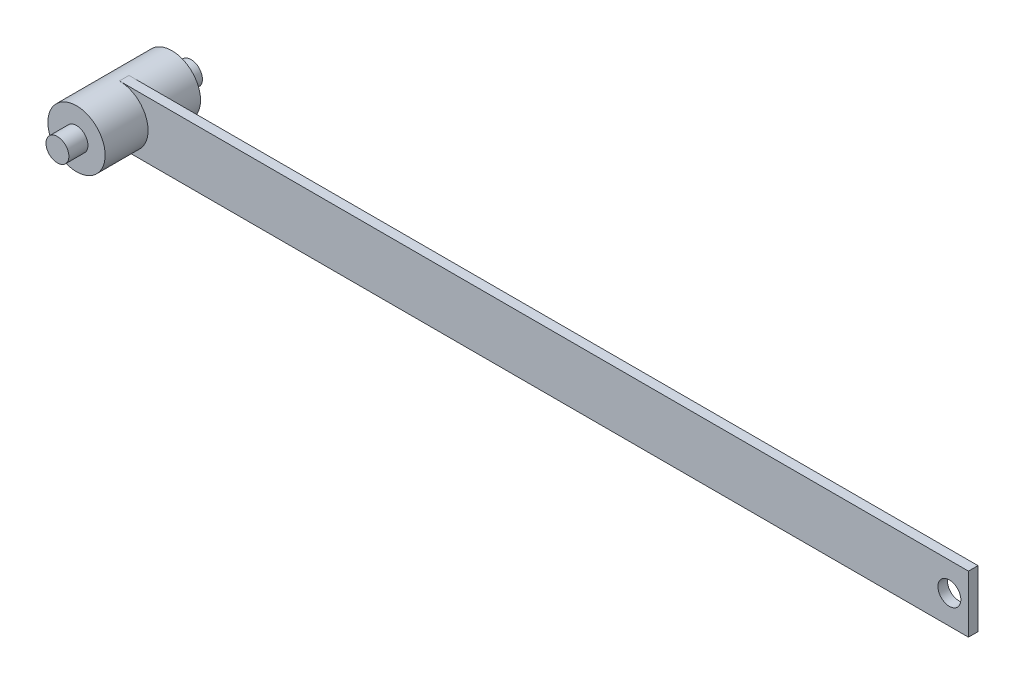
ISO-10303-21;
HEADER;
FILE_DESCRIPTION(('STEP AP214'),'2;1');
FILE_NAME('part.step','',(''),(''),'','','');
FILE_SCHEMA(('AUTOMOTIVE_DESIGN { 1 0 10303 214 1 1 1 1 }'));
ENDSEC;
DATA;
#1=APPLICATION_CONTEXT('core data for automotive mechanical design processes');
#2=APPLICATION_PROTOCOL_DEFINITION('international standard','automotive_design',2000,#1);
#3=PRODUCT_CONTEXT('',#1,'mechanical');
#4=PRODUCT('Part','Part','',(#3));
#5=PRODUCT_RELATED_PRODUCT_CATEGORY('part','',(#4));
#6=PRODUCT_DEFINITION_FORMATION('','',#4);
#7=PRODUCT_DEFINITION_CONTEXT('part definition',#1,'design');
#8=PRODUCT_DEFINITION('design','',#6,#7);
#9=PRODUCT_DEFINITION_SHAPE('','',#8);
#10=(LENGTH_UNIT() NAMED_UNIT(*) SI_UNIT(.MILLI.,.METRE.));
#11=(NAMED_UNIT(*) PLANE_ANGLE_UNIT() SI_UNIT($,.RADIAN.));
#12=(NAMED_UNIT(*) SI_UNIT($,.STERADIAN.) SOLID_ANGLE_UNIT());
#13=UNCERTAINTY_MEASURE_WITH_UNIT(LENGTH_MEASURE(1.E-05),#10,'distance_accuracy_value','');
#14=(GEOMETRIC_REPRESENTATION_CONTEXT(3) GLOBAL_UNCERTAINTY_ASSIGNED_CONTEXT((#13)) GLOBAL_UNIT_ASSIGNED_CONTEXT((#10,
#11,#12)) REPRESENTATION_CONTEXT('',''));
#15=CARTESIAN_POINT('',(0.,0.,0.));
#16=DIRECTION('',(0.,0.,1.));
#17=DIRECTION('',(1.,0.,0.));
#18=AXIS2_PLACEMENT_3D('',#15,#16,#17);
#19=CARTESIAN_POINT('',(-215.,0.,-2.5));
#20=DIRECTION('',(0.,0.,-1.));
#21=DIRECTION('',(-1.,0.,0.));
#22=AXIS2_PLACEMENT_3D('',#19,#20,#21);
#23=CYLINDRICAL_SURFACE('',#22,15.);
#24=DIRECTION('',(0.,0.,-1.));
#25=VECTOR('',#24,1.);
#26=CARTESIAN_POINT('',(-215.,15.,2.5));
#27=LINE('',#26,#25);
#28=CARTESIAN_POINT('',(-215.,15.,-2.5));
#29=VERTEX_POINT('',#28);
#30=CARTESIAN_POINT('',(-215.,15.,2.5));
#31=VERTEX_POINT('',#30);
#32=EDGE_CURVE('E94',#29,#31,#27,.F.);
#33=ORIENTED_EDGE('',*,*,#32,.F.);
#34=CARTESIAN_POINT('',(-215.,0.,-2.5));
#35=DIRECTION('',(0.,0.,1.));
#36=DIRECTION('',(1.,0.,0.));
#37=AXIS2_PLACEMENT_3D('',#34,#35,#36);
#38=CIRCLE('',#37,15.);
#39=CARTESIAN_POINT('',(-215.,-15.,-2.5));
#40=VERTEX_POINT('',#39);
#41=EDGE_CURVE('E62',#29,#40,#38,.F.);
#42=ORIENTED_EDGE('',*,*,#41,.T.);
#43=DIRECTION('',(0.,0.,-1.));
#44=VECTOR('',#43,1.);
#45=CARTESIAN_POINT('',(-215.,-15.,2.5));
#46=LINE('',#45,#44);
#47=CARTESIAN_POINT('',(-215.,-15.,2.5));
#48=VERTEX_POINT('',#47);
#49=EDGE_CURVE('E46',#48,#40,#46,.T.);
#50=ORIENTED_EDGE('',*,*,#49,.F.);
#51=CARTESIAN_POINT('',(-215.,0.,2.5));
#52=DIRECTION('',(0.,0.,1.));
#53=DIRECTION('',(1.,0.,0.));
#54=AXIS2_PLACEMENT_3D('',#51,#52,#53);
#55=CIRCLE('',#54,15.);
#56=EDGE_CURVE('E54',#31,#48,#55,.F.);
#57=ORIENTED_EDGE('',*,*,#56,.F.);
#58=EDGE_LOOP('',(#33,#42,#50,#57));
#59=FACE_BOUND('',#58,.T.);
#60=CARTESIAN_POINT('',(-215.,0.,-25.));
#61=DIRECTION('',(0.,0.,1.));
#62=DIRECTION('',(1.,0.,0.));
#63=AXIS2_PLACEMENT_3D('',#60,#61,#62);
#64=CIRCLE('',#63,15.);
#65=CARTESIAN_POINT('',(-200.,0.,-25.));
#66=VERTEX_POINT('',#65);
#67=EDGE_CURVE('E103',#66,#66,#64,.T.);
#68=ORIENTED_EDGE('',*,*,#67,.T.);
#69=EDGE_LOOP('',(#68));
#70=FACE_BOUND('',#69,.T.);
#71=CARTESIAN_POINT('',(-215.,0.,25.));
#72=DIRECTION('',(0.,0.,1.));
#73=DIRECTION('',(1.,0.,0.));
#74=AXIS2_PLACEMENT_3D('',#71,#72,#73);
#75=CIRCLE('',#74,15.);
#76=CARTESIAN_POINT('',(-200.,0.,25.));
#77=VERTEX_POINT('',#76);
#78=EDGE_CURVE('E98',#77,#77,#75,.T.);
#79=ORIENTED_EDGE('',*,*,#78,.F.);
#80=EDGE_LOOP('',(#79));
#81=FACE_BOUND('',#80,.T.);
#82=ADVANCED_FACE('F37',(#59,#70,#81),#23,.T.);
#83=CARTESIAN_POINT('',(0.,0.,2.5));
#84=DIRECTION('',(0.,0.,1.));
#85=DIRECTION('',(1.,0.,0.));
#86=AXIS2_PLACEMENT_3D('',#83,#84,#85);
#87=PLANE('',#86);
#88=DIRECTION('',(-1.,0.,0.));
#89=VECTOR('',#88,1.);
#90=CARTESIAN_POINT('',(-230.,15.,2.5));
#91=LINE('',#90,#89);
#92=CARTESIAN_POINT('',(230.,15.,2.5));
#93=VERTEX_POINT('',#92);
#94=EDGE_CURVE('E114',#93,#31,#91,.T.);
#95=ORIENTED_EDGE('',*,*,#94,.T.);
#96=ORIENTED_EDGE('',*,*,#56,.T.);
#97=DIRECTION('',(1.,0.,0.));
#98=VECTOR('',#97,1.);
#99=CARTESIAN_POINT('',(-230.,-15.,2.5));
#100=LINE('',#99,#98);
#101=CARTESIAN_POINT('',(230.,-15.,2.5));
#102=VERTEX_POINT('',#101);
#103=EDGE_CURVE('E92',#48,#102,#100,.T.);
#104=ORIENTED_EDGE('',*,*,#103,.T.);
#105=DIRECTION('',(0.,1.,0.));
#106=VECTOR('',#105,1.);
#107=CARTESIAN_POINT('',(230.,15.,2.5));
#108=LINE('',#107,#106);
#109=EDGE_CURVE('E87',#102,#93,#108,.T.);
#110=ORIENTED_EDGE('',*,*,#109,.T.);
#111=EDGE_LOOP('',(#95,#96,#104,#110));
#112=FACE_BOUND('',#111,.T.);
#113=CARTESIAN_POINT('',(220.,0.,2.5));
#114=DIRECTION('',(0.,0.,1.));
#115=DIRECTION('',(1.,0.,0.));
#116=AXIS2_PLACEMENT_3D('',#113,#114,#115);
#117=CIRCLE('',#116,6.00000000000002);
#118=CARTESIAN_POINT('',(226.,0.,2.5));
#119=VERTEX_POINT('',#118);
#120=EDGE_CURVE('E107',#119,#119,#117,.T.);
#121=ORIENTED_EDGE('',*,*,#120,.F.);
#122=EDGE_LOOP('',(#121));
#123=FACE_BOUND('',#122,.T.);
#124=ADVANCED_FACE('F126',(#112,#123),#87,.T.);
#125=CARTESIAN_POINT('',(0.,0.,-2.5));
#126=DIRECTION('',(0.,0.,1.));
#127=DIRECTION('',(1.,0.,0.));
#128=AXIS2_PLACEMENT_3D('',#125,#126,#127);
#129=PLANE('',#128);
#130=ORIENTED_EDGE('',*,*,#41,.F.);
#131=DIRECTION('',(-1.,0.,0.));
#132=VECTOR('',#131,1.);
#133=CARTESIAN_POINT('',(-230.,15.,-2.5));
#134=LINE('',#133,#132);
#135=CARTESIAN_POINT('',(230.,15.,-2.5));
#136=VERTEX_POINT('',#135);
#137=EDGE_CURVE('E88',#136,#29,#134,.T.);
#138=ORIENTED_EDGE('',*,*,#137,.F.);
#139=DIRECTION('',(0.,1.,0.));
#140=VECTOR('',#139,1.);
#141=CARTESIAN_POINT('',(230.,15.,-2.5));
#142=LINE('',#141,#140);
#143=CARTESIAN_POINT('',(230.,-15.,-2.5));
#144=VERTEX_POINT('',#143);
#145=EDGE_CURVE('E83',#144,#136,#142,.T.);
#146=ORIENTED_EDGE('',*,*,#145,.F.);
#147=DIRECTION('',(1.,0.,0.));
#148=VECTOR('',#147,1.);
#149=CARTESIAN_POINT('',(-230.,-15.,-2.5));
#150=LINE('',#149,#148);
#151=EDGE_CURVE('E78',#40,#144,#150,.T.);
#152=ORIENTED_EDGE('',*,*,#151,.F.);
#153=EDGE_LOOP('',(#130,#138,#146,#152));
#154=FACE_BOUND('',#153,.T.);
#155=CARTESIAN_POINT('',(220.,0.,-2.5));
#156=DIRECTION('',(0.,0.,1.));
#157=DIRECTION('',(1.,0.,0.));
#158=AXIS2_PLACEMENT_3D('',#155,#156,#157);
#159=CIRCLE('',#158,6.00000000000002);
#160=CARTESIAN_POINT('',(226.,0.,-2.5));
#161=VERTEX_POINT('',#160);
#162=EDGE_CURVE('E100',#161,#161,#159,.T.);
#163=ORIENTED_EDGE('',*,*,#162,.T.);
#164=EDGE_LOOP('',(#163));
#165=FACE_BOUND('',#164,.T.);
#166=ADVANCED_FACE('F80',(#154,#165),#129,.F.);
#167=CARTESIAN_POINT('',(230.,15.,2.5));
#168=DIRECTION('',(-1.,0.,0.));
#169=DIRECTION('',(0.,0.,1.));
#170=AXIS2_PLACEMENT_3D('',#167,#168,#169);
#171=PLANE('',#170);
#172=ORIENTED_EDGE('',*,*,#145,.T.);
#173=DIRECTION('',(0.,0.,-1.));
#174=VECTOR('',#173,1.);
#175=CARTESIAN_POINT('',(230.,15.,2.5));
#176=LINE('',#175,#174);
#177=EDGE_CURVE('E121',#93,#136,#176,.T.);
#178=ORIENTED_EDGE('',*,*,#177,.F.);
#179=ORIENTED_EDGE('',*,*,#109,.F.);
#180=DIRECTION('',(0.,0.,-1.));
#181=VECTOR('',#180,1.);
#182=CARTESIAN_POINT('',(230.,-15.,2.5));
#183=LINE('',#182,#181);
#184=EDGE_CURVE('E117',#102,#144,#183,.T.);
#185=ORIENTED_EDGE('',*,*,#184,.T.);
#186=EDGE_LOOP('',(#172,#178,#179,#185));
#187=FACE_BOUND('',#186,.T.);
#188=ADVANCED_FACE('F131',(#187),#171,.F.);
#189=CARTESIAN_POINT('',(-230.,15.,2.5));
#190=DIRECTION('',(0.,-1.,0.));
#191=DIRECTION('',(0.,0.,-1.));
#192=AXIS2_PLACEMENT_3D('',#189,#190,#191);
#193=PLANE('',#192);
#194=ORIENTED_EDGE('',*,*,#137,.T.);
#195=ORIENTED_EDGE('',*,*,#32,.T.);
#196=ORIENTED_EDGE('',*,*,#94,.F.);
#197=ORIENTED_EDGE('',*,*,#177,.T.);
#198=EDGE_LOOP('',(#194,#195,#196,#197));
#199=FACE_BOUND('',#198,.T.);
#200=ADVANCED_FACE('F125',(#199),#193,.F.);
#201=CARTESIAN_POINT('',(-230.,-15.,2.5));
#202=DIRECTION('',(0.,1.,0.));
#203=DIRECTION('',(0.,0.,1.));
#204=AXIS2_PLACEMENT_3D('',#201,#202,#203);
#205=PLANE('',#204);
#206=ORIENTED_EDGE('',*,*,#103,.F.);
#207=ORIENTED_EDGE('',*,*,#49,.T.);
#208=ORIENTED_EDGE('',*,*,#151,.T.);
#209=ORIENTED_EDGE('',*,*,#184,.F.);
#210=EDGE_LOOP('',(#206,#207,#208,#209));
#211=FACE_BOUND('',#210,.T.);
#212=ADVANCED_FACE('F91',(#211),#205,.F.);
#213=CARTESIAN_POINT('',(220.,0.,2.5));
#214=DIRECTION('',(0.,0.,-1.));
#215=DIRECTION('',(-1.,0.,0.));
#216=AXIS2_PLACEMENT_3D('',#213,#214,#215);
#217=CYLINDRICAL_SURFACE('',#216,6.00000000000002);
#218=ORIENTED_EDGE('',*,*,#120,.T.);
#219=EDGE_LOOP('',(#218));
#220=FACE_BOUND('',#219,.T.);
#221=ORIENTED_EDGE('',*,*,#162,.F.);
#222=EDGE_LOOP('',(#221));
#223=FACE_BOUND('',#222,.T.);
#224=ADVANCED_FACE('F147',(#220,#223),#217,.F.);
#225=CARTESIAN_POINT('',(-215.,0.,-25.));
#226=DIRECTION('',(0.,0.,1.));
#227=DIRECTION('',(1.,0.,0.));
#228=AXIS2_PLACEMENT_3D('',#225,#226,#227);
#229=PLANE('',#228);
#230=CARTESIAN_POINT('',(-215.,0.,-25.));
#231=DIRECTION('',(0.,0.,1.));
#232=DIRECTION('',(1.,0.,0.));
#233=AXIS2_PLACEMENT_3D('',#230,#231,#232);
#234=CIRCLE('',#233,6.00000000000002);
#235=CARTESIAN_POINT('',(-209.,0.,-25.));
#236=VERTEX_POINT('',#235);
#237=EDGE_CURVE('E11',#236,#236,#234,.F.);
#238=ORIENTED_EDGE('',*,*,#237,.F.);
#239=EDGE_LOOP('',(#238));
#240=FACE_BOUND('',#239,.T.);
#241=ORIENTED_EDGE('',*,*,#67,.F.);
#242=EDGE_LOOP('',(#241));
#243=FACE_BOUND('',#242,.T.);
#244=ADVANCED_FACE('F154',(#240,#243),#229,.F.);
#245=CARTESIAN_POINT('',(-215.,0.,25.));
#246=DIRECTION('',(0.,0.,1.));
#247=DIRECTION('',(1.,0.,0.));
#248=AXIS2_PLACEMENT_3D('',#245,#246,#247);
#249=PLANE('',#248);
#250=CARTESIAN_POINT('',(-215.,0.,25.));
#251=DIRECTION('',(0.,0.,1.));
#252=DIRECTION('',(1.,0.,0.));
#253=AXIS2_PLACEMENT_3D('',#250,#251,#252);
#254=CIRCLE('',#253,6.00000000000002);
#255=CARTESIAN_POINT('',(-209.,0.,25.));
#256=VERTEX_POINT('',#255);
#257=EDGE_CURVE('E41',#256,#256,#254,.F.);
#258=ORIENTED_EDGE('',*,*,#257,.T.);
#259=EDGE_LOOP('',(#258));
#260=FACE_BOUND('',#259,.T.);
#261=ORIENTED_EDGE('',*,*,#78,.T.);
#262=EDGE_LOOP('',(#261));
#263=FACE_BOUND('',#262,.T.);
#264=ADVANCED_FACE('F159',(#260,#263),#249,.T.);
#265=CARTESIAN_POINT('',(-215.,0.,35.));
#266=DIRECTION('',(0.,0.,1.));
#267=DIRECTION('',(1.,0.,0.));
#268=AXIS2_PLACEMENT_3D('',#265,#266,#267);
#269=PLANE('',#268);
#270=CARTESIAN_POINT('',(-215.,0.,35.));
#271=DIRECTION('',(0.,0.,1.));
#272=DIRECTION('',(1.,0.,0.));
#273=AXIS2_PLACEMENT_3D('',#270,#271,#272);
#274=CIRCLE('',#273,6.00000000000002);
#275=CARTESIAN_POINT('',(-209.,0.,35.));
#276=VERTEX_POINT('',#275);
#277=EDGE_CURVE('E188',#276,#276,#274,.T.);
#278=ORIENTED_EDGE('',*,*,#277,.T.);
#279=EDGE_LOOP('',(#278));
#280=FACE_BOUND('',#279,.T.);
#281=ADVANCED_FACE('F167',(#280),#269,.T.);
#282=CARTESIAN_POINT('',(-215.,0.,35.));
#283=DIRECTION('',(0.,0.,-1.));
#284=DIRECTION('',(-1.,0.,0.));
#285=AXIS2_PLACEMENT_3D('',#282,#283,#284);
#286=CYLINDRICAL_SURFACE('',#285,6.00000000000002);
#287=ORIENTED_EDGE('',*,*,#257,.F.);
#288=EDGE_LOOP('',(#287));
#289=FACE_BOUND('',#288,.T.);
#290=ORIENTED_EDGE('',*,*,#277,.F.);
#291=EDGE_LOOP('',(#290));
#292=FACE_BOUND('',#291,.T.);
#293=ADVANCED_FACE('F173',(#289,#292),#286,.T.);
#294=CARTESIAN_POINT('',(-215.,0.,-35.));
#295=DIRECTION('',(0.,0.,1.));
#296=DIRECTION('',(1.,0.,0.));
#297=AXIS2_PLACEMENT_3D('',#294,#295,#296);
#298=CIRCLE('',#297,6.00000000000002);
#299=CARTESIAN_POINT('',(-209.,0.,-35.));
#300=VERTEX_POINT('',#299);
#301=EDGE_CURVE('E190',#300,#300,#298,.T.);
#302=ORIENTED_EDGE('',*,*,#301,.T.);
#303=EDGE_LOOP('',(#302));
#304=FACE_BOUND('',#303,.T.);
#305=ORIENTED_EDGE('',*,*,#237,.T.);
#306=EDGE_LOOP('',(#305));
#307=FACE_BOUND('',#306,.T.);
#308=ADVANCED_FACE('F176',(#304,#307),#286,.T.);
#309=CARTESIAN_POINT('',(-215.,0.,-35.));
#310=DIRECTION('',(0.,0.,1.));
#311=DIRECTION('',(1.,0.,0.));
#312=AXIS2_PLACEMENT_3D('',#309,#310,#311);
#313=PLANE('',#312);
#314=ORIENTED_EDGE('',*,*,#301,.F.);
#315=EDGE_LOOP('',(#314));
#316=FACE_BOUND('',#315,.T.);
#317=ADVANCED_FACE('F178',(#316),#313,.F.);
#318=CLOSED_SHELL('',(#82,#124,#166,#188,#200,#212,#224,#244,#264,#281,#293,#308,#317));
#319=MANIFOLD_SOLID_BREP('B2',#318);
#320=ADVANCED_BREP_SHAPE_REPRESENTATION('',(#18,#319),#14);
#321=SHAPE_DEFINITION_REPRESENTATION(#9,#320);
ENDSEC;
END-ISO-10303-21;
